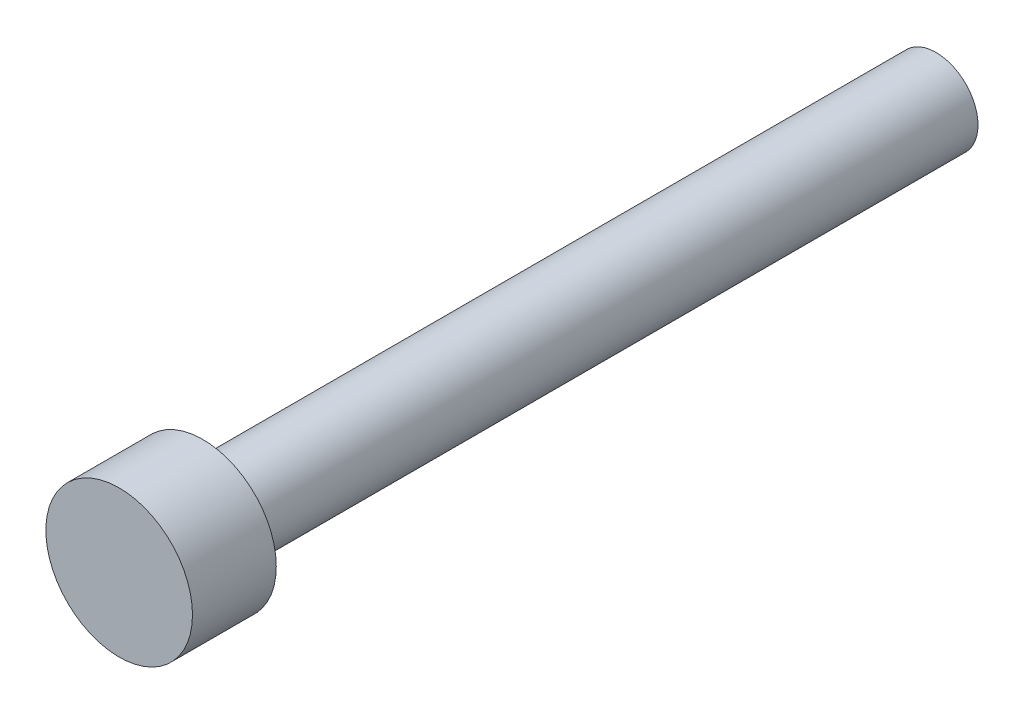
ISO-10303-21;
HEADER;
FILE_DESCRIPTION(('STEP AP214'),'2;1');
FILE_NAME('part.step','',(''),(''),'','','');
FILE_SCHEMA(('AUTOMOTIVE_DESIGN { 1 0 10303 214 1 1 1 1 }'));
ENDSEC;
DATA;
#1=APPLICATION_CONTEXT('core data for automotive mechanical design processes');
#2=APPLICATION_PROTOCOL_DEFINITION('international standard','automotive_design',2000,#1);
#3=PRODUCT_CONTEXT('',#1,'mechanical');
#4=PRODUCT('Part','Part','',(#3));
#5=PRODUCT_RELATED_PRODUCT_CATEGORY('part','',(#4));
#6=PRODUCT_DEFINITION_FORMATION('','',#4);
#7=PRODUCT_DEFINITION_CONTEXT('part definition',#1,'design');
#8=PRODUCT_DEFINITION('design','',#6,#7);
#9=PRODUCT_DEFINITION_SHAPE('','',#8);
#10=(LENGTH_UNIT() NAMED_UNIT(*) SI_UNIT(.MILLI.,.METRE.));
#11=(NAMED_UNIT(*) PLANE_ANGLE_UNIT() SI_UNIT($,.RADIAN.));
#12=(NAMED_UNIT(*) SI_UNIT($,.STERADIAN.) SOLID_ANGLE_UNIT());
#13=UNCERTAINTY_MEASURE_WITH_UNIT(LENGTH_MEASURE(1.E-05),#10,'distance_accuracy_value','');
#14=(GEOMETRIC_REPRESENTATION_CONTEXT(3) GLOBAL_UNCERTAINTY_ASSIGNED_CONTEXT((#13)) GLOBAL_UNIT_ASSIGNED_CONTEXT((#10,
#11,#12)) REPRESENTATION_CONTEXT('',''));
#15=CARTESIAN_POINT('',(0.,0.,0.));
#16=DIRECTION('',(0.,0.,1.));
#17=DIRECTION('',(1.,0.,0.));
#18=AXIS2_PLACEMENT_3D('',#15,#16,#17);
#19=CARTESIAN_POINT('',(0.,0.,0.));
#20=DIRECTION('',(0.,0.,-1.));
#21=DIRECTION('',(-1.,0.,0.));
#22=AXIS2_PLACEMENT_3D('',#19,#20,#21);
#23=CYLINDRICAL_SURFACE('',#22,2.);
#24=CARTESIAN_POINT('',(0.,0.,0.));
#25=DIRECTION('',(0.,0.,1.));
#26=DIRECTION('',(1.,0.,0.));
#27=AXIS2_PLACEMENT_3D('',#24,#25,#26);
#28=CIRCLE('',#27,2.);
#29=CARTESIAN_POINT('',(2.,0.,0.));
#30=VERTEX_POINT('',#29);
#31=EDGE_CURVE('E10',#30,#30,#28,.T.);
#32=ORIENTED_EDGE('',*,*,#31,.F.);
#33=EDGE_LOOP('',(#32));
#34=FACE_BOUND('',#33,.T.);
#35=CARTESIAN_POINT('',(0.,0.,-35.));
#36=DIRECTION('',(0.,0.,1.));
#37=DIRECTION('',(1.,0.,0.));
#38=AXIS2_PLACEMENT_3D('',#35,#36,#37);
#39=CIRCLE('',#38,2.);
#40=CARTESIAN_POINT('',(2.,0.,-35.));
#41=VERTEX_POINT('',#40);
#42=EDGE_CURVE('E37',#41,#41,#39,.T.);
#43=ORIENTED_EDGE('',*,*,#42,.T.);
#44=EDGE_LOOP('',(#43));
#45=FACE_BOUND('',#44,.T.);
#46=ADVANCED_FACE('F40',(#34,#45),#23,.T.);
#47=CARTESIAN_POINT('',(0.,0.,-35.));
#48=DIRECTION('',(0.,0.,1.));
#49=DIRECTION('',(1.,0.,0.));
#50=AXIS2_PLACEMENT_3D('',#47,#48,#49);
#51=PLANE('',#50);
#52=ORIENTED_EDGE('',*,*,#42,.F.);
#53=EDGE_LOOP('',(#52));
#54=FACE_BOUND('',#53,.T.);
#55=ADVANCED_FACE('F58',(#54),#51,.F.);
#56=CARTESIAN_POINT('',(0.,0.,4.));
#57=DIRECTION('',(0.,0.,-1.));
#58=DIRECTION('',(-1.,0.,0.));
#59=AXIS2_PLACEMENT_3D('',#56,#57,#58);
#60=CYLINDRICAL_SURFACE('',#59,3.5);
#61=CARTESIAN_POINT('',(0.,0.,4.));
#62=DIRECTION('',(0.,0.,1.));
#63=DIRECTION('',(1.,0.,0.));
#64=AXIS2_PLACEMENT_3D('',#61,#62,#63);
#65=CIRCLE('',#64,3.5);
#66=CARTESIAN_POINT('',(3.5,0.,4.));
#67=VERTEX_POINT('',#66);
#68=EDGE_CURVE('E50',#67,#67,#65,.T.);
#69=ORIENTED_EDGE('',*,*,#68,.F.);
#70=EDGE_LOOP('',(#69));
#71=FACE_BOUND('',#70,.T.);
#72=CARTESIAN_POINT('',(0.,0.,0.));
#73=DIRECTION('',(0.,0.,1.));
#74=DIRECTION('',(1.,0.,0.));
#75=AXIS2_PLACEMENT_3D('',#72,#73,#74);
#76=CIRCLE('',#75,3.5);
#77=CARTESIAN_POINT('',(3.5,0.,0.));
#78=VERTEX_POINT('',#77);
#79=EDGE_CURVE('E47',#78,#78,#76,.T.);
#80=ORIENTED_EDGE('',*,*,#79,.T.);
#81=EDGE_LOOP('',(#80));
#82=FACE_BOUND('',#81,.T.);
#83=ADVANCED_FACE('F60',(#71,#82),#60,.T.);
#84=CARTESIAN_POINT('',(0.,0.,4.));
#85=DIRECTION('',(0.,0.,1.));
#86=DIRECTION('',(1.,0.,0.));
#87=AXIS2_PLACEMENT_3D('',#84,#85,#86);
#88=PLANE('',#87);
#89=ORIENTED_EDGE('',*,*,#68,.T.);
#90=EDGE_LOOP('',(#89));
#91=FACE_BOUND('',#90,.T.);
#92=ADVANCED_FACE('F54',(#91),#88,.T.);
#93=CARTESIAN_POINT('',(0.,0.,0.));
#94=DIRECTION('',(0.,0.,1.));
#95=DIRECTION('',(1.,0.,0.));
#96=AXIS2_PLACEMENT_3D('',#93,#94,#95);
#97=PLANE('',#96);
#98=ORIENTED_EDGE('',*,*,#31,.T.);
#99=EDGE_LOOP('',(#98));
#100=FACE_BOUND('',#99,.T.);
#101=ORIENTED_EDGE('',*,*,#79,.F.);
#102=EDGE_LOOP('',(#101));
#103=FACE_BOUND('',#102,.T.);
#104=ADVANCED_FACE('F65',(#100,#103),#97,.F.);
#105=CLOSED_SHELL('',(#46,#55,#83,#92,#104));
#106=MANIFOLD_SOLID_BREP('B2',#105);
#107=ADVANCED_BREP_SHAPE_REPRESENTATION('',(#18,#106),#14);
#108=SHAPE_DEFINITION_REPRESENTATION(#9,#107);
ENDSEC;
END-ISO-10303-21;
